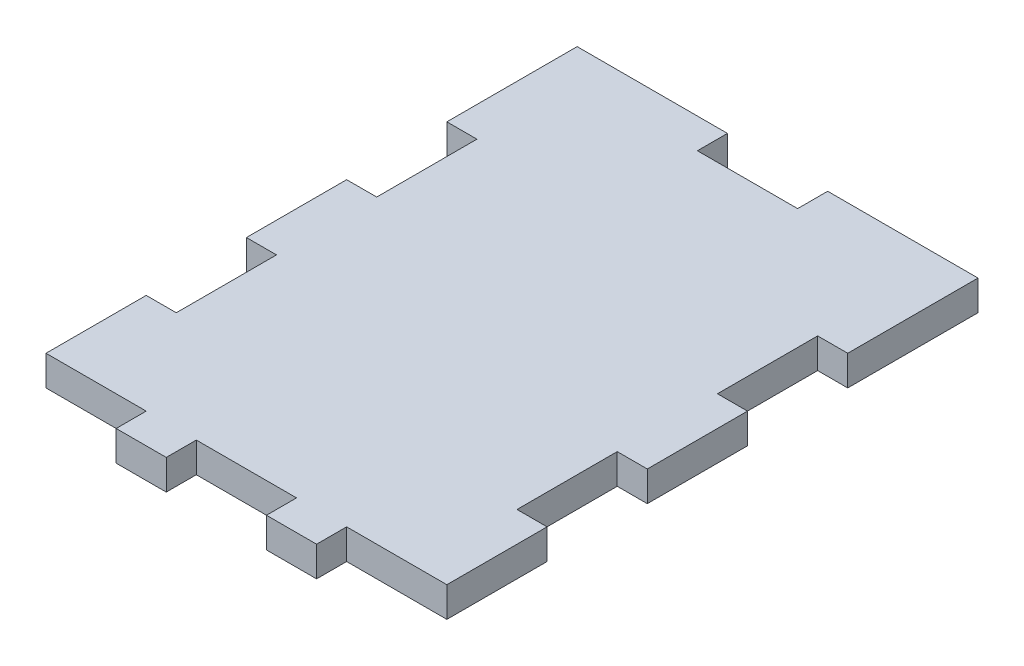
ISO-10303-21;
HEADER;
FILE_DESCRIPTION(('STEP AP214'),'2;1');
FILE_NAME('part.step','',(''),(''),'','','');
FILE_SCHEMA(('AUTOMOTIVE_DESIGN { 1 0 10303 214 1 1 1 1 }'));
ENDSEC;
DATA;
#1=APPLICATION_CONTEXT('core data for automotive mechanical design processes');
#2=APPLICATION_PROTOCOL_DEFINITION('international standard','automotive_design',2000,#1);
#3=PRODUCT_CONTEXT('',#1,'mechanical');
#4=PRODUCT('Part','Part','',(#3));
#5=PRODUCT_RELATED_PRODUCT_CATEGORY('part','',(#4));
#6=PRODUCT_DEFINITION_FORMATION('','',#4);
#7=PRODUCT_DEFINITION_CONTEXT('part definition',#1,'design');
#8=PRODUCT_DEFINITION('design','',#6,#7);
#9=PRODUCT_DEFINITION_SHAPE('','',#8);
#10=(LENGTH_UNIT() NAMED_UNIT(*) SI_UNIT(.MILLI.,.METRE.));
#11=(NAMED_UNIT(*) PLANE_ANGLE_UNIT() SI_UNIT($,.RADIAN.));
#12=(NAMED_UNIT(*) SI_UNIT($,.STERADIAN.) SOLID_ANGLE_UNIT());
#13=UNCERTAINTY_MEASURE_WITH_UNIT(LENGTH_MEASURE(1.E-05),#10,'distance_accuracy_value','');
#14=(GEOMETRIC_REPRESENTATION_CONTEXT(3) GLOBAL_UNCERTAINTY_ASSIGNED_CONTEXT((#13)) GLOBAL_UNIT_ASSIGNED_CONTEXT((#10,
#11,#12)) REPRESENTATION_CONTEXT('',''));
#15=CARTESIAN_POINT('',(0.,0.,0.));
#16=DIRECTION('',(0.,0.,1.));
#17=DIRECTION('',(1.,0.,0.));
#18=AXIS2_PLACEMENT_3D('',#15,#16,#17);
#19=CARTESIAN_POINT('',(0.,6.,0.));
#20=DIRECTION('',(-1.,0.,0.));
#21=DIRECTION('',(0.,0.,1.));
#22=AXIS2_PLACEMENT_3D('',#19,#20,#21);
#23=PLANE('',#22);
#24=DIRECTION('',(0.,0.,-1.));
#25=VECTOR('',#24,1.);
#26=CARTESIAN_POINT('',(0.,0.,0.));
#27=LINE('',#26,#25);
#28=CARTESIAN_POINT('',(0.,0.,0.));
#29=VERTEX_POINT('',#28);
#30=CARTESIAN_POINT('',(0.,0.,-20.));
#31=VERTEX_POINT('',#30);
#32=EDGE_CURVE('E273',#29,#31,#27,.T.);
#33=ORIENTED_EDGE('',*,*,#32,.T.);
#34=DIRECTION('',(0.,-1.,0.));
#35=VECTOR('',#34,1.);
#36=CARTESIAN_POINT('',(0.,6.,-20.));
#37=LINE('',#36,#35);
#38=CARTESIAN_POINT('',(0.,6.,-20.));
#39=VERTEX_POINT('',#38);
#40=EDGE_CURVE('E11',#39,#31,#37,.T.);
#41=ORIENTED_EDGE('',*,*,#40,.F.);
#42=DIRECTION('',(0.,0.,-1.));
#43=VECTOR('',#42,1.);
#44=CARTESIAN_POINT('',(0.,6.,0.));
#45=LINE('',#44,#43);
#46=CARTESIAN_POINT('',(0.,6.,0.));
#47=VERTEX_POINT('',#46);
#48=EDGE_CURVE('E335',#47,#39,#45,.T.);
#49=ORIENTED_EDGE('',*,*,#48,.F.);
#50=DIRECTION('',(0.,-1.,0.));
#51=VECTOR('',#50,1.);
#52=CARTESIAN_POINT('',(0.,6.,0.));
#53=LINE('',#52,#51);
#54=EDGE_CURVE('E269',#47,#29,#53,.T.);
#55=ORIENTED_EDGE('',*,*,#54,.T.);
#56=EDGE_LOOP('',(#33,#41,#49,#55));
#57=FACE_BOUND('',#56,.T.);
#58=ADVANCED_FACE('F33',(#57),#23,.F.);
#59=CARTESIAN_POINT('',(0.,6.,-20.));
#60=DIRECTION('',(0.,0.,1.));
#61=DIRECTION('',(1.,0.,0.));
#62=AXIS2_PLACEMENT_3D('',#59,#60,#61);
#63=PLANE('',#62);
#64=DIRECTION('',(-1.,0.,0.));
#65=VECTOR('',#64,1.);
#66=CARTESIAN_POINT('',(0.,0.,-20.));
#67=LINE('',#66,#65);
#68=CARTESIAN_POINT('',(-6.00000000000001,0.,-20.));
#69=VERTEX_POINT('',#68);
#70=EDGE_CURVE('E276',#31,#69,#67,.T.);
#71=ORIENTED_EDGE('',*,*,#70,.T.);
#72=DIRECTION('',(0.,-1.,0.));
#73=VECTOR('',#72,1.);
#74=CARTESIAN_POINT('',(-6.00000000000001,6.,-20.));
#75=LINE('',#74,#73);
#76=CARTESIAN_POINT('',(-6.00000000000001,6.,-20.));
#77=VERTEX_POINT('',#76);
#78=EDGE_CURVE('E41',#77,#69,#75,.T.);
#79=ORIENTED_EDGE('',*,*,#78,.F.);
#80=DIRECTION('',(-1.,0.,0.));
#81=VECTOR('',#80,1.);
#82=CARTESIAN_POINT('',(0.,6.,-20.));
#83=LINE('',#82,#81);
#84=EDGE_CURVE('E164',#39,#77,#83,.T.);
#85=ORIENTED_EDGE('',*,*,#84,.F.);
#86=ORIENTED_EDGE('',*,*,#40,.T.);
#87=EDGE_LOOP('',(#71,#79,#85,#86));
#88=FACE_BOUND('',#87,.T.);
#89=ADVANCED_FACE('F513',(#88),#63,.F.);
#90=CARTESIAN_POINT('',(-6.00000000000001,6.,-20.));
#91=DIRECTION('',(-1.,0.,0.));
#92=DIRECTION('',(0.,0.,1.));
#93=AXIS2_PLACEMENT_3D('',#90,#91,#92);
#94=PLANE('',#93);
#95=DIRECTION('',(0.,0.,-1.));
#96=VECTOR('',#95,1.);
#97=CARTESIAN_POINT('',(-6.00000000000001,0.,-20.));
#98=LINE('',#97,#96);
#99=CARTESIAN_POINT('',(-6.00000000000001,0.,-40.));
#100=VERTEX_POINT('',#99);
#101=EDGE_CURVE('E278',#69,#100,#98,.T.);
#102=ORIENTED_EDGE('',*,*,#101,.T.);
#103=DIRECTION('',(0.,-1.,0.));
#104=VECTOR('',#103,1.);
#105=CARTESIAN_POINT('',(-6.00000000000001,6.,-40.));
#106=LINE('',#105,#104);
#107=CARTESIAN_POINT('',(-6.00000000000001,6.,-40.));
#108=VERTEX_POINT('',#107);
#109=EDGE_CURVE('E414',#108,#100,#106,.T.);
#110=ORIENTED_EDGE('',*,*,#109,.F.);
#111=DIRECTION('',(0.,0.,-1.));
#112=VECTOR('',#111,1.);
#113=CARTESIAN_POINT('',(-6.00000000000001,6.,-20.));
#114=LINE('',#113,#112);
#115=EDGE_CURVE('E422',#77,#108,#114,.T.);
#116=ORIENTED_EDGE('',*,*,#115,.F.);
#117=ORIENTED_EDGE('',*,*,#78,.T.);
#118=EDGE_LOOP('',(#102,#110,#116,#117));
#119=FACE_BOUND('',#118,.T.);
#120=ADVANCED_FACE('F420',(#119),#94,.F.);
#121=CARTESIAN_POINT('',(-6.00000000000001,6.,-40.));
#122=DIRECTION('',(0.,0.,-1.));
#123=DIRECTION('',(-1.,0.,0.));
#124=AXIS2_PLACEMENT_3D('',#121,#122,#123);
#125=PLANE('',#124);
#126=DIRECTION('',(1.,0.,0.));
#127=VECTOR('',#126,1.);
#128=CARTESIAN_POINT('',(-6.00000000000001,0.,-40.));
#129=LINE('',#128,#127);
#130=CARTESIAN_POINT('',(0.,0.,-40.));
#131=VERTEX_POINT('',#130);
#132=EDGE_CURVE('E280',#100,#131,#129,.T.);
#133=ORIENTED_EDGE('',*,*,#132,.T.);
#134=DIRECTION('',(0.,-1.,0.));
#135=VECTOR('',#134,1.);
#136=CARTESIAN_POINT('',(0.,6.,-40.));
#137=LINE('',#136,#135);
#138=CARTESIAN_POINT('',(0.,6.,-40.));
#139=VERTEX_POINT('',#138);
#140=EDGE_CURVE('E411',#139,#131,#137,.T.);
#141=ORIENTED_EDGE('',*,*,#140,.F.);
#142=DIRECTION('',(1.,0.,0.));
#143=VECTOR('',#142,1.);
#144=CARTESIAN_POINT('',(-6.00000000000001,6.,-40.));
#145=LINE('',#144,#143);
#146=EDGE_CURVE('E440',#108,#139,#145,.T.);
#147=ORIENTED_EDGE('',*,*,#146,.F.);
#148=ORIENTED_EDGE('',*,*,#109,.T.);
#149=EDGE_LOOP('',(#133,#141,#147,#148));
#150=FACE_BOUND('',#149,.T.);
#151=ADVANCED_FACE('F431',(#150),#125,.F.);
#152=CARTESIAN_POINT('',(0.,6.,-40.));
#153=DIRECTION('',(-1.,0.,0.));
#154=DIRECTION('',(0.,0.,1.));
#155=AXIS2_PLACEMENT_3D('',#152,#153,#154);
#156=PLANE('',#155);
#157=DIRECTION('',(0.,0.,-1.));
#158=VECTOR('',#157,1.);
#159=CARTESIAN_POINT('',(0.,0.,-40.));
#160=LINE('',#159,#158);
#161=CARTESIAN_POINT('',(0.,0.,-60.));
#162=VERTEX_POINT('',#161);
#163=EDGE_CURVE('E282',#131,#162,#160,.T.);
#164=ORIENTED_EDGE('',*,*,#163,.T.);
#165=DIRECTION('',(0.,-1.,0.));
#166=VECTOR('',#165,1.);
#167=CARTESIAN_POINT('',(0.,6.,-60.));
#168=LINE('',#167,#166);
#169=CARTESIAN_POINT('',(0.,6.,-60.));
#170=VERTEX_POINT('',#169);
#171=EDGE_CURVE('E408',#170,#162,#168,.T.);
#172=ORIENTED_EDGE('',*,*,#171,.F.);
#173=DIRECTION('',(0.,0.,-1.));
#174=VECTOR('',#173,1.);
#175=CARTESIAN_POINT('',(0.,6.,-40.));
#176=LINE('',#175,#174);
#177=EDGE_CURVE('E437',#139,#170,#176,.T.);
#178=ORIENTED_EDGE('',*,*,#177,.F.);
#179=ORIENTED_EDGE('',*,*,#140,.T.);
#180=EDGE_LOOP('',(#164,#172,#178,#179));
#181=FACE_BOUND('',#180,.T.);
#182=ADVANCED_FACE('F435',(#181),#156,.F.);
#183=CARTESIAN_POINT('',(0.,6.,-60.));
#184=DIRECTION('',(0.,0.,1.));
#185=DIRECTION('',(1.,0.,0.));
#186=AXIS2_PLACEMENT_3D('',#183,#184,#185);
#187=PLANE('',#186);
#188=DIRECTION('',(-1.,0.,0.));
#189=VECTOR('',#188,1.);
#190=CARTESIAN_POINT('',(0.,0.,-60.));
#191=LINE('',#190,#189);
#192=CARTESIAN_POINT('',(-6.00000000000001,0.,-60.));
#193=VERTEX_POINT('',#192);
#194=EDGE_CURVE('E284',#162,#193,#191,.T.);
#195=ORIENTED_EDGE('',*,*,#194,.T.);
#196=DIRECTION('',(0.,-1.,0.));
#197=VECTOR('',#196,1.);
#198=CARTESIAN_POINT('',(-6.00000000000001,6.,-60.));
#199=LINE('',#198,#197);
#200=CARTESIAN_POINT('',(-6.00000000000001,6.,-60.));
#201=VERTEX_POINT('',#200);
#202=EDGE_CURVE('E405',#201,#193,#199,.T.);
#203=ORIENTED_EDGE('',*,*,#202,.F.);
#204=DIRECTION('',(-1.,0.,0.));
#205=VECTOR('',#204,1.);
#206=CARTESIAN_POINT('',(0.,6.,-60.));
#207=LINE('',#206,#205);
#208=EDGE_CURVE('E439',#170,#201,#207,.T.);
#209=ORIENTED_EDGE('',*,*,#208,.F.);
#210=ORIENTED_EDGE('',*,*,#171,.T.);
#211=EDGE_LOOP('',(#195,#203,#209,#210));
#212=FACE_BOUND('',#211,.T.);
#213=ADVANCED_FACE('F526',(#212),#187,.F.);
#214=CARTESIAN_POINT('',(-6.00000000000001,6.,-60.));
#215=DIRECTION('',(-1.,0.,0.));
#216=DIRECTION('',(0.,0.,1.));
#217=AXIS2_PLACEMENT_3D('',#214,#215,#216);
#218=PLANE('',#217);
#219=DIRECTION('',(0.,0.,-1.));
#220=VECTOR('',#219,1.);
#221=CARTESIAN_POINT('',(-6.00000000000001,0.,-60.));
#222=LINE('',#221,#220);
#223=CARTESIAN_POINT('',(-6.00000000000001,0.,-80.));
#224=VERTEX_POINT('',#223);
#225=EDGE_CURVE('E286',#193,#224,#222,.T.);
#226=ORIENTED_EDGE('',*,*,#225,.T.);
#227=DIRECTION('',(0.,-1.,0.));
#228=VECTOR('',#227,1.);
#229=CARTESIAN_POINT('',(-6.00000000000001,6.,-80.));
#230=LINE('',#229,#228);
#231=CARTESIAN_POINT('',(-6.00000000000001,6.,-80.));
#232=VERTEX_POINT('',#231);
#233=EDGE_CURVE('E402',#232,#224,#230,.T.);
#234=ORIENTED_EDGE('',*,*,#233,.F.);
#235=DIRECTION('',(0.,0.,-1.));
#236=VECTOR('',#235,1.);
#237=CARTESIAN_POINT('',(-6.00000000000001,6.,-60.));
#238=LINE('',#237,#236);
#239=EDGE_CURVE('E442',#201,#232,#238,.T.);
#240=ORIENTED_EDGE('',*,*,#239,.F.);
#241=ORIENTED_EDGE('',*,*,#202,.T.);
#242=EDGE_LOOP('',(#226,#234,#240,#241));
#243=FACE_BOUND('',#242,.T.);
#244=ADVANCED_FACE('F529',(#243),#218,.F.);
#245=CARTESIAN_POINT('',(-6.00000000000001,6.,-80.));
#246=DIRECTION('',(0.,0.,-1.));
#247=DIRECTION('',(-1.,0.,0.));
#248=AXIS2_PLACEMENT_3D('',#245,#246,#247);
#249=PLANE('',#248);
#250=DIRECTION('',(1.,0.,0.));
#251=VECTOR('',#250,1.);
#252=CARTESIAN_POINT('',(-6.00000000000001,0.,-80.));
#253=LINE('',#252,#251);
#254=CARTESIAN_POINT('',(0.,0.,-80.));
#255=VERTEX_POINT('',#254);
#256=EDGE_CURVE('E288',#224,#255,#253,.T.);
#257=ORIENTED_EDGE('',*,*,#256,.T.);
#258=DIRECTION('',(0.,-1.,0.));
#259=VECTOR('',#258,1.);
#260=CARTESIAN_POINT('',(0.,6.,-80.));
#261=LINE('',#260,#259);
#262=CARTESIAN_POINT('',(0.,6.,-80.));
#263=VERTEX_POINT('',#262);
#264=EDGE_CURVE('E399',#263,#255,#261,.T.);
#265=ORIENTED_EDGE('',*,*,#264,.F.);
#266=DIRECTION('',(1.,0.,0.));
#267=VECTOR('',#266,1.);
#268=CARTESIAN_POINT('',(-6.00000000000001,6.,-80.));
#269=LINE('',#268,#267);
#270=EDGE_CURVE('E448',#232,#263,#269,.T.);
#271=ORIENTED_EDGE('',*,*,#270,.F.);
#272=ORIENTED_EDGE('',*,*,#233,.T.);
#273=EDGE_LOOP('',(#257,#265,#271,#272));
#274=FACE_BOUND('',#273,.T.);
#275=ADVANCED_FACE('F533',(#274),#249,.F.);
#276=CARTESIAN_POINT('',(0.,6.,-80.));
#277=DIRECTION('',(-1.,0.,0.));
#278=DIRECTION('',(0.,0.,1.));
#279=AXIS2_PLACEMENT_3D('',#276,#277,#278);
#280=PLANE('',#279);
#281=DIRECTION('',(0.,0.,-1.));
#282=VECTOR('',#281,1.);
#283=CARTESIAN_POINT('',(0.,0.,-80.));
#284=LINE('',#283,#282);
#285=CARTESIAN_POINT('',(0.,0.,-106.));
#286=VERTEX_POINT('',#285);
#287=EDGE_CURVE('E290',#255,#286,#284,.T.);
#288=ORIENTED_EDGE('',*,*,#287,.T.);
#289=DIRECTION('',(0.,-1.,0.));
#290=VECTOR('',#289,1.);
#291=CARTESIAN_POINT('',(0.,6.,-106.));
#292=LINE('',#291,#290);
#293=CARTESIAN_POINT('',(0.,6.,-106.));
#294=VERTEX_POINT('',#293);
#295=EDGE_CURVE('E396',#294,#286,#292,.T.);
#296=ORIENTED_EDGE('',*,*,#295,.F.);
#297=DIRECTION('',(0.,0.,-1.));
#298=VECTOR('',#297,1.);
#299=CARTESIAN_POINT('',(0.,6.,-80.));
#300=LINE('',#299,#298);
#301=EDGE_CURVE('E450',#263,#294,#300,.T.);
#302=ORIENTED_EDGE('',*,*,#301,.F.);
#303=ORIENTED_EDGE('',*,*,#264,.T.);
#304=EDGE_LOOP('',(#288,#296,#302,#303));
#305=FACE_BOUND('',#304,.T.);
#306=ADVANCED_FACE('F537',(#305),#280,.F.);
#307=CARTESIAN_POINT('',(0.,6.,-106.));
#308=DIRECTION('',(0.,0.,1.));
#309=DIRECTION('',(1.,0.,0.));
#310=AXIS2_PLACEMENT_3D('',#307,#308,#309);
#311=PLANE('',#310);
#312=DIRECTION('',(-1.,0.,0.));
#313=VECTOR('',#312,1.);
#314=CARTESIAN_POINT('',(0.,0.,-106.));
#315=LINE('',#314,#313);
#316=CARTESIAN_POINT('',(-30.,0.,-106.));
#317=VERTEX_POINT('',#316);
#318=EDGE_CURVE('E292',#286,#317,#315,.T.);
#319=ORIENTED_EDGE('',*,*,#318,.T.);
#320=DIRECTION('',(0.,-1.,0.));
#321=VECTOR('',#320,1.);
#322=CARTESIAN_POINT('',(-30.,6.,-106.));
#323=LINE('',#322,#321);
#324=CARTESIAN_POINT('',(-30.,6.,-106.));
#325=VERTEX_POINT('',#324);
#326=EDGE_CURVE('E393',#325,#317,#323,.T.);
#327=ORIENTED_EDGE('',*,*,#326,.F.);
#328=DIRECTION('',(-1.,0.,0.));
#329=VECTOR('',#328,1.);
#330=CARTESIAN_POINT('',(0.,6.,-106.));
#331=LINE('',#330,#329);
#332=EDGE_CURVE('E452',#294,#325,#331,.T.);
#333=ORIENTED_EDGE('',*,*,#332,.F.);
#334=ORIENTED_EDGE('',*,*,#295,.T.);
#335=EDGE_LOOP('',(#319,#327,#333,#334));
#336=FACE_BOUND('',#335,.T.);
#337=ADVANCED_FACE('F541',(#336),#311,.F.);
#338=CARTESIAN_POINT('',(-30.,6.,-100.));
#339=DIRECTION('',(1.,0.,0.));
#340=DIRECTION('',(0.,0.,-1.));
#341=AXIS2_PLACEMENT_3D('',#338,#339,#340);
#342=PLANE('',#341);
#343=DIRECTION('',(0.,0.,1.));
#344=VECTOR('',#343,1.);
#345=CARTESIAN_POINT('',(-30.,0.,-100.));
#346=LINE('',#345,#344);
#347=CARTESIAN_POINT('',(-30.,0.,-100.));
#348=VERTEX_POINT('',#347);
#349=EDGE_CURVE('E294',#317,#348,#346,.T.);
#350=ORIENTED_EDGE('',*,*,#349,.T.);
#351=DIRECTION('',(0.,-1.,0.));
#352=VECTOR('',#351,1.);
#353=CARTESIAN_POINT('',(-30.,6.,-100.));
#354=LINE('',#353,#352);
#355=CARTESIAN_POINT('',(-30.,6.,-100.));
#356=VERTEX_POINT('',#355);
#357=EDGE_CURVE('E390',#356,#348,#354,.T.);
#358=ORIENTED_EDGE('',*,*,#357,.F.);
#359=DIRECTION('',(0.,0.,1.));
#360=VECTOR('',#359,1.);
#361=CARTESIAN_POINT('',(-30.,6.,-100.));
#362=LINE('',#361,#360);
#363=EDGE_CURVE('E454',#325,#356,#362,.T.);
#364=ORIENTED_EDGE('',*,*,#363,.F.);
#365=ORIENTED_EDGE('',*,*,#326,.T.);
#366=EDGE_LOOP('',(#350,#358,#364,#365));
#367=FACE_BOUND('',#366,.T.);
#368=ADVANCED_FACE('F545',(#367),#342,.F.);
#369=CARTESIAN_POINT('',(-50.,6.,-100.));
#370=DIRECTION('',(0.,0.,1.));
#371=DIRECTION('',(1.,0.,0.));
#372=AXIS2_PLACEMENT_3D('',#369,#370,#371);
#373=PLANE('',#372);
#374=DIRECTION('',(-1.,0.,0.));
#375=VECTOR('',#374,1.);
#376=CARTESIAN_POINT('',(-50.,0.,-100.));
#377=LINE('',#376,#375);
#378=CARTESIAN_POINT('',(-50.,0.,-100.));
#379=VERTEX_POINT('',#378);
#380=EDGE_CURVE('E296',#348,#379,#377,.T.);
#381=ORIENTED_EDGE('',*,*,#380,.T.);
#382=DIRECTION('',(0.,-1.,0.));
#383=VECTOR('',#382,1.);
#384=CARTESIAN_POINT('',(-50.,6.,-100.));
#385=LINE('',#384,#383);
#386=CARTESIAN_POINT('',(-50.,6.,-100.));
#387=VERTEX_POINT('',#386);
#388=EDGE_CURVE('E387',#387,#379,#385,.T.);
#389=ORIENTED_EDGE('',*,*,#388,.F.);
#390=DIRECTION('',(-1.,0.,0.));
#391=VECTOR('',#390,1.);
#392=CARTESIAN_POINT('',(-50.,6.,-100.));
#393=LINE('',#392,#391);
#394=EDGE_CURVE('E456',#356,#387,#393,.T.);
#395=ORIENTED_EDGE('',*,*,#394,.F.);
#396=ORIENTED_EDGE('',*,*,#357,.T.);
#397=EDGE_LOOP('',(#381,#389,#395,#396));
#398=FACE_BOUND('',#397,.T.);
#399=ADVANCED_FACE('F549',(#398),#373,.F.);
#400=CARTESIAN_POINT('',(-50.,6.,-106.));
#401=DIRECTION('',(-1.,0.,0.));
#402=DIRECTION('',(0.,0.,1.));
#403=AXIS2_PLACEMENT_3D('',#400,#401,#402);
#404=PLANE('',#403);
#405=DIRECTION('',(0.,0.,-1.));
#406=VECTOR('',#405,1.);
#407=CARTESIAN_POINT('',(-50.,0.,-106.));
#408=LINE('',#407,#406);
#409=CARTESIAN_POINT('',(-50.,0.,-106.));
#410=VERTEX_POINT('',#409);
#411=EDGE_CURVE('E298',#379,#410,#408,.T.);
#412=ORIENTED_EDGE('',*,*,#411,.T.);
#413=DIRECTION('',(0.,-1.,0.));
#414=VECTOR('',#413,1.);
#415=CARTESIAN_POINT('',(-50.,6.,-106.));
#416=LINE('',#415,#414);
#417=CARTESIAN_POINT('',(-50.,6.,-106.));
#418=VERTEX_POINT('',#417);
#419=EDGE_CURVE('E384',#418,#410,#416,.T.);
#420=ORIENTED_EDGE('',*,*,#419,.F.);
#421=DIRECTION('',(0.,0.,-1.));
#422=VECTOR('',#421,1.);
#423=CARTESIAN_POINT('',(-50.,6.,-106.));
#424=LINE('',#423,#422);
#425=EDGE_CURVE('E458',#387,#418,#424,.T.);
#426=ORIENTED_EDGE('',*,*,#425,.F.);
#427=ORIENTED_EDGE('',*,*,#388,.T.);
#428=EDGE_LOOP('',(#412,#420,#426,#427));
#429=FACE_BOUND('',#428,.T.);
#430=ADVANCED_FACE('F553',(#429),#404,.F.);
#431=CARTESIAN_POINT('',(-50.,6.,-106.));
#432=DIRECTION('',(0.,0.,1.));
#433=DIRECTION('',(1.,0.,0.));
#434=AXIS2_PLACEMENT_3D('',#431,#432,#433);
#435=PLANE('',#434);
#436=DIRECTION('',(-1.,0.,0.));
#437=VECTOR('',#436,1.);
#438=CARTESIAN_POINT('',(-50.,0.,-106.));
#439=LINE('',#438,#437);
#440=CARTESIAN_POINT('',(-80.,0.,-106.));
#441=VERTEX_POINT('',#440);
#442=EDGE_CURVE('E300',#410,#441,#439,.T.);
#443=ORIENTED_EDGE('',*,*,#442,.T.);
#444=DIRECTION('',(0.,-1.,0.));
#445=VECTOR('',#444,1.);
#446=CARTESIAN_POINT('',(-80.,6.,-106.));
#447=LINE('',#446,#445);
#448=CARTESIAN_POINT('',(-80.,6.,-106.));
#449=VERTEX_POINT('',#448);
#450=EDGE_CURVE('E381',#449,#441,#447,.T.);
#451=ORIENTED_EDGE('',*,*,#450,.F.);
#452=DIRECTION('',(-1.,0.,0.));
#453=VECTOR('',#452,1.);
#454=CARTESIAN_POINT('',(-50.,6.,-106.));
#455=LINE('',#454,#453);
#456=EDGE_CURVE('E460',#418,#449,#455,.T.);
#457=ORIENTED_EDGE('',*,*,#456,.F.);
#458=ORIENTED_EDGE('',*,*,#419,.T.);
#459=EDGE_LOOP('',(#443,#451,#457,#458));
#460=FACE_BOUND('',#459,.T.);
#461=ADVANCED_FACE('F557',(#460),#435,.F.);
#462=CARTESIAN_POINT('',(-80.,6.,-80.));
#463=DIRECTION('',(1.,0.,0.));
#464=DIRECTION('',(0.,0.,-1.));
#465=AXIS2_PLACEMENT_3D('',#462,#463,#464);
#466=PLANE('',#465);
#467=DIRECTION('',(0.,0.,1.));
#468=VECTOR('',#467,1.);
#469=CARTESIAN_POINT('',(-80.,0.,-80.));
#470=LINE('',#469,#468);
#471=CARTESIAN_POINT('',(-80.,0.,-80.));
#472=VERTEX_POINT('',#471);
#473=EDGE_CURVE('E302',#441,#472,#470,.T.);
#474=ORIENTED_EDGE('',*,*,#473,.T.);
#475=DIRECTION('',(0.,-1.,0.));
#476=VECTOR('',#475,1.);
#477=CARTESIAN_POINT('',(-80.,6.,-80.));
#478=LINE('',#477,#476);
#479=CARTESIAN_POINT('',(-80.,6.,-80.));
#480=VERTEX_POINT('',#479);
#481=EDGE_CURVE('E378',#480,#472,#478,.T.);
#482=ORIENTED_EDGE('',*,*,#481,.F.);
#483=DIRECTION('',(0.,0.,1.));
#484=VECTOR('',#483,1.);
#485=CARTESIAN_POINT('',(-80.,6.,-80.));
#486=LINE('',#485,#484);
#487=EDGE_CURVE('E462',#449,#480,#486,.T.);
#488=ORIENTED_EDGE('',*,*,#487,.F.);
#489=ORIENTED_EDGE('',*,*,#450,.T.);
#490=EDGE_LOOP('',(#474,#482,#488,#489));
#491=FACE_BOUND('',#490,.T.);
#492=ADVANCED_FACE('F561',(#491),#466,.F.);
#493=CARTESIAN_POINT('',(-80.,6.,-80.));
#494=DIRECTION('',(0.,0.,-1.));
#495=DIRECTION('',(-1.,0.,0.));
#496=AXIS2_PLACEMENT_3D('',#493,#494,#495);
#497=PLANE('',#496);
#498=DIRECTION('',(1.,0.,0.));
#499=VECTOR('',#498,1.);
#500=CARTESIAN_POINT('',(-80.,0.,-80.));
#501=LINE('',#500,#499);
#502=CARTESIAN_POINT('',(-74.,0.,-80.));
#503=VERTEX_POINT('',#502);
#504=EDGE_CURVE('E304',#472,#503,#501,.T.);
#505=ORIENTED_EDGE('',*,*,#504,.T.);
#506=DIRECTION('',(0.,-1.,0.));
#507=VECTOR('',#506,1.);
#508=CARTESIAN_POINT('',(-74.,6.,-80.));
#509=LINE('',#508,#507);
#510=CARTESIAN_POINT('',(-74.,6.,-80.));
#511=VERTEX_POINT('',#510);
#512=EDGE_CURVE('E375',#511,#503,#509,.T.);
#513=ORIENTED_EDGE('',*,*,#512,.F.);
#514=DIRECTION('',(1.,0.,0.));
#515=VECTOR('',#514,1.);
#516=CARTESIAN_POINT('',(-80.,6.,-80.));
#517=LINE('',#516,#515);
#518=EDGE_CURVE('E464',#480,#511,#517,.T.);
#519=ORIENTED_EDGE('',*,*,#518,.F.);
#520=ORIENTED_EDGE('',*,*,#481,.T.);
#521=EDGE_LOOP('',(#505,#513,#519,#520));
#522=FACE_BOUND('',#521,.T.);
#523=ADVANCED_FACE('F565',(#522),#497,.F.);
#524=CARTESIAN_POINT('',(-74.,6.,-80.));
#525=DIRECTION('',(1.,0.,0.));
#526=DIRECTION('',(0.,0.,-1.));
#527=AXIS2_PLACEMENT_3D('',#524,#525,#526);
#528=PLANE('',#527);
#529=DIRECTION('',(0.,0.,1.));
#530=VECTOR('',#529,1.);
#531=CARTESIAN_POINT('',(-74.,0.,-80.));
#532=LINE('',#531,#530);
#533=CARTESIAN_POINT('',(-74.,0.,-60.));
#534=VERTEX_POINT('',#533);
#535=EDGE_CURVE('E306',#503,#534,#532,.T.);
#536=ORIENTED_EDGE('',*,*,#535,.T.);
#537=DIRECTION('',(0.,-1.,0.));
#538=VECTOR('',#537,1.);
#539=CARTESIAN_POINT('',(-74.,6.,-60.));
#540=LINE('',#539,#538);
#541=CARTESIAN_POINT('',(-74.,6.,-60.));
#542=VERTEX_POINT('',#541);
#543=EDGE_CURVE('E372',#542,#534,#540,.T.);
#544=ORIENTED_EDGE('',*,*,#543,.F.);
#545=DIRECTION('',(0.,0.,1.));
#546=VECTOR('',#545,1.);
#547=CARTESIAN_POINT('',(-74.,6.,-80.));
#548=LINE('',#547,#546);
#549=EDGE_CURVE('E466',#511,#542,#548,.T.);
#550=ORIENTED_EDGE('',*,*,#549,.F.);
#551=ORIENTED_EDGE('',*,*,#512,.T.);
#552=EDGE_LOOP('',(#536,#544,#550,#551));
#553=FACE_BOUND('',#552,.T.);
#554=ADVANCED_FACE('F569',(#553),#528,.F.);
#555=CARTESIAN_POINT('',(-74.,6.,-60.));
#556=DIRECTION('',(0.,0.,1.));
#557=DIRECTION('',(1.,0.,0.));
#558=AXIS2_PLACEMENT_3D('',#555,#556,#557);
#559=PLANE('',#558);
#560=DIRECTION('',(-1.,0.,0.));
#561=VECTOR('',#560,1.);
#562=CARTESIAN_POINT('',(-74.,0.,-60.));
#563=LINE('',#562,#561);
#564=CARTESIAN_POINT('',(-80.,0.,-60.));
#565=VERTEX_POINT('',#564);
#566=EDGE_CURVE('E308',#534,#565,#563,.T.);
#567=ORIENTED_EDGE('',*,*,#566,.T.);
#568=DIRECTION('',(0.,-1.,0.));
#569=VECTOR('',#568,1.);
#570=CARTESIAN_POINT('',(-80.,6.,-60.));
#571=LINE('',#570,#569);
#572=CARTESIAN_POINT('',(-80.,6.,-60.));
#573=VERTEX_POINT('',#572);
#574=EDGE_CURVE('E369',#573,#565,#571,.T.);
#575=ORIENTED_EDGE('',*,*,#574,.F.);
#576=DIRECTION('',(-1.,0.,0.));
#577=VECTOR('',#576,1.);
#578=CARTESIAN_POINT('',(-74.,6.,-60.));
#579=LINE('',#578,#577);
#580=EDGE_CURVE('E468',#542,#573,#579,.T.);
#581=ORIENTED_EDGE('',*,*,#580,.F.);
#582=ORIENTED_EDGE('',*,*,#543,.T.);
#583=EDGE_LOOP('',(#567,#575,#581,#582));
#584=FACE_BOUND('',#583,.T.);
#585=ADVANCED_FACE('F573',(#584),#559,.F.);
#586=CARTESIAN_POINT('',(-80.,6.,-60.));
#587=DIRECTION('',(1.,0.,0.));
#588=DIRECTION('',(0.,0.,-1.));
#589=AXIS2_PLACEMENT_3D('',#586,#587,#588);
#590=PLANE('',#589);
#591=DIRECTION('',(0.,0.,1.));
#592=VECTOR('',#591,1.);
#593=CARTESIAN_POINT('',(-80.,0.,-60.));
#594=LINE('',#593,#592);
#595=CARTESIAN_POINT('',(-80.,0.,-40.));
#596=VERTEX_POINT('',#595);
#597=EDGE_CURVE('E310',#565,#596,#594,.T.);
#598=ORIENTED_EDGE('',*,*,#597,.T.);
#599=DIRECTION('',(0.,-1.,0.));
#600=VECTOR('',#599,1.);
#601=CARTESIAN_POINT('',(-80.,6.,-40.));
#602=LINE('',#601,#600);
#603=CARTESIAN_POINT('',(-80.,6.,-40.));
#604=VERTEX_POINT('',#603);
#605=EDGE_CURVE('E366',#604,#596,#602,.T.);
#606=ORIENTED_EDGE('',*,*,#605,.F.);
#607=DIRECTION('',(0.,0.,1.));
#608=VECTOR('',#607,1.);
#609=CARTESIAN_POINT('',(-80.,6.,-60.));
#610=LINE('',#609,#608);
#611=EDGE_CURVE('E470',#573,#604,#610,.T.);
#612=ORIENTED_EDGE('',*,*,#611,.F.);
#613=ORIENTED_EDGE('',*,*,#574,.T.);
#614=EDGE_LOOP('',(#598,#606,#612,#613));
#615=FACE_BOUND('',#614,.T.);
#616=ADVANCED_FACE('F577',(#615),#590,.F.);
#617=CARTESIAN_POINT('',(-80.,6.,-40.));
#618=DIRECTION('',(0.,0.,-1.));
#619=DIRECTION('',(-1.,0.,0.));
#620=AXIS2_PLACEMENT_3D('',#617,#618,#619);
#621=PLANE('',#620);
#622=DIRECTION('',(1.,0.,0.));
#623=VECTOR('',#622,1.);
#624=CARTESIAN_POINT('',(-80.,0.,-40.));
#625=LINE('',#624,#623);
#626=CARTESIAN_POINT('',(-74.,0.,-40.));
#627=VERTEX_POINT('',#626);
#628=EDGE_CURVE('E312',#596,#627,#625,.T.);
#629=ORIENTED_EDGE('',*,*,#628,.T.);
#630=DIRECTION('',(0.,-1.,0.));
#631=VECTOR('',#630,1.);
#632=CARTESIAN_POINT('',(-74.,6.,-40.));
#633=LINE('',#632,#631);
#634=CARTESIAN_POINT('',(-74.,6.,-40.));
#635=VERTEX_POINT('',#634);
#636=EDGE_CURVE('E363',#635,#627,#633,.T.);
#637=ORIENTED_EDGE('',*,*,#636,.F.);
#638=DIRECTION('',(1.,0.,0.));
#639=VECTOR('',#638,1.);
#640=CARTESIAN_POINT('',(-80.,6.,-40.));
#641=LINE('',#640,#639);
#642=EDGE_CURVE('E472',#604,#635,#641,.T.);
#643=ORIENTED_EDGE('',*,*,#642,.F.);
#644=ORIENTED_EDGE('',*,*,#605,.T.);
#645=EDGE_LOOP('',(#629,#637,#643,#644));
#646=FACE_BOUND('',#645,.T.);
#647=ADVANCED_FACE('F581',(#646),#621,.F.);
#648=CARTESIAN_POINT('',(-74.,6.,-40.));
#649=DIRECTION('',(1.,0.,0.));
#650=DIRECTION('',(0.,0.,-1.));
#651=AXIS2_PLACEMENT_3D('',#648,#649,#650);
#652=PLANE('',#651);
#653=DIRECTION('',(0.,0.,1.));
#654=VECTOR('',#653,1.);
#655=CARTESIAN_POINT('',(-74.,0.,-40.));
#656=LINE('',#655,#654);
#657=CARTESIAN_POINT('',(-74.,0.,-20.));
#658=VERTEX_POINT('',#657);
#659=EDGE_CURVE('E314',#627,#658,#656,.T.);
#660=ORIENTED_EDGE('',*,*,#659,.T.);
#661=DIRECTION('',(0.,-1.,0.));
#662=VECTOR('',#661,1.);
#663=CARTESIAN_POINT('',(-74.,6.,-20.));
#664=LINE('',#663,#662);
#665=CARTESIAN_POINT('',(-74.,6.,-20.));
#666=VERTEX_POINT('',#665);
#667=EDGE_CURVE('E360',#666,#658,#664,.T.);
#668=ORIENTED_EDGE('',*,*,#667,.F.);
#669=DIRECTION('',(0.,0.,1.));
#670=VECTOR('',#669,1.);
#671=CARTESIAN_POINT('',(-74.,6.,-40.));
#672=LINE('',#671,#670);
#673=EDGE_CURVE('E474',#635,#666,#672,.T.);
#674=ORIENTED_EDGE('',*,*,#673,.F.);
#675=ORIENTED_EDGE('',*,*,#636,.T.);
#676=EDGE_LOOP('',(#660,#668,#674,#675));
#677=FACE_BOUND('',#676,.T.);
#678=ADVANCED_FACE('F585',(#677),#652,.F.);
#679=CARTESIAN_POINT('',(-74.,6.,-20.));
#680=DIRECTION('',(0.,0.,1.));
#681=DIRECTION('',(1.,0.,0.));
#682=AXIS2_PLACEMENT_3D('',#679,#680,#681);
#683=PLANE('',#682);
#684=DIRECTION('',(-1.,0.,0.));
#685=VECTOR('',#684,1.);
#686=CARTESIAN_POINT('',(-74.,0.,-20.));
#687=LINE('',#686,#685);
#688=CARTESIAN_POINT('',(-80.,0.,-20.));
#689=VERTEX_POINT('',#688);
#690=EDGE_CURVE('E316',#658,#689,#687,.T.);
#691=ORIENTED_EDGE('',*,*,#690,.T.);
#692=DIRECTION('',(0.,-1.,0.));
#693=VECTOR('',#692,1.);
#694=CARTESIAN_POINT('',(-80.,6.,-20.));
#695=LINE('',#694,#693);
#696=CARTESIAN_POINT('',(-80.,6.,-20.));
#697=VERTEX_POINT('',#696);
#698=EDGE_CURVE('E357',#697,#689,#695,.T.);
#699=ORIENTED_EDGE('',*,*,#698,.F.);
#700=DIRECTION('',(-1.,0.,0.));
#701=VECTOR('',#700,1.);
#702=CARTESIAN_POINT('',(-74.,6.,-20.));
#703=LINE('',#702,#701);
#704=EDGE_CURVE('E476',#666,#697,#703,.T.);
#705=ORIENTED_EDGE('',*,*,#704,.F.);
#706=ORIENTED_EDGE('',*,*,#667,.T.);
#707=EDGE_LOOP('',(#691,#699,#705,#706));
#708=FACE_BOUND('',#707,.T.);
#709=ADVANCED_FACE('F589',(#708),#683,.F.);
#710=CARTESIAN_POINT('',(-80.,6.,0.));
#711=DIRECTION('',(1.,0.,0.));
#712=DIRECTION('',(0.,0.,-1.));
#713=AXIS2_PLACEMENT_3D('',#710,#711,#712);
#714=PLANE('',#713);
#715=DIRECTION('',(0.,0.,1.));
#716=VECTOR('',#715,1.);
#717=CARTESIAN_POINT('',(-80.,0.,0.));
#718=LINE('',#717,#716);
#719=CARTESIAN_POINT('',(-80.,0.,0.));
#720=VERTEX_POINT('',#719);
#721=EDGE_CURVE('E318',#689,#720,#718,.T.);
#722=ORIENTED_EDGE('',*,*,#721,.T.);
#723=DIRECTION('',(0.,-1.,0.));
#724=VECTOR('',#723,1.);
#725=CARTESIAN_POINT('',(-80.,6.,0.));
#726=LINE('',#725,#724);
#727=CARTESIAN_POINT('',(-80.,6.,0.));
#728=VERTEX_POINT('',#727);
#729=EDGE_CURVE('E354',#728,#720,#726,.T.);
#730=ORIENTED_EDGE('',*,*,#729,.F.);
#731=DIRECTION('',(0.,0.,1.));
#732=VECTOR('',#731,1.);
#733=CARTESIAN_POINT('',(-80.,6.,0.));
#734=LINE('',#733,#732);
#735=EDGE_CURVE('E478',#697,#728,#734,.T.);
#736=ORIENTED_EDGE('',*,*,#735,.F.);
#737=ORIENTED_EDGE('',*,*,#698,.T.);
#738=EDGE_LOOP('',(#722,#730,#736,#737));
#739=FACE_BOUND('',#738,.T.);
#740=ADVANCED_FACE('F593',(#739),#714,.F.);
#741=CARTESIAN_POINT('',(-60.,6.,0.));
#742=DIRECTION('',(0.,0.,-1.));
#743=DIRECTION('',(-1.,0.,0.));
#744=AXIS2_PLACEMENT_3D('',#741,#742,#743);
#745=PLANE('',#744);
#746=DIRECTION('',(1.,0.,0.));
#747=VECTOR('',#746,1.);
#748=CARTESIAN_POINT('',(-60.,0.,0.));
#749=LINE('',#748,#747);
#750=CARTESIAN_POINT('',(-60.,0.,0.));
#751=VERTEX_POINT('',#750);
#752=EDGE_CURVE('E320',#720,#751,#749,.T.);
#753=ORIENTED_EDGE('',*,*,#752,.T.);
#754=DIRECTION('',(0.,-1.,0.));
#755=VECTOR('',#754,1.);
#756=CARTESIAN_POINT('',(-60.,6.,0.));
#757=LINE('',#756,#755);
#758=CARTESIAN_POINT('',(-60.,6.,0.));
#759=VERTEX_POINT('',#758);
#760=EDGE_CURVE('E351',#759,#751,#757,.T.);
#761=ORIENTED_EDGE('',*,*,#760,.F.);
#762=DIRECTION('',(1.,0.,0.));
#763=VECTOR('',#762,1.);
#764=CARTESIAN_POINT('',(-60.,6.,0.));
#765=LINE('',#764,#763);
#766=EDGE_CURVE('E480',#728,#759,#765,.T.);
#767=ORIENTED_EDGE('',*,*,#766,.F.);
#768=ORIENTED_EDGE('',*,*,#729,.T.);
#769=EDGE_LOOP('',(#753,#761,#767,#768));
#770=FACE_BOUND('',#769,.T.);
#771=ADVANCED_FACE('F597',(#770),#745,.F.);
#772=CARTESIAN_POINT('',(-60.,6.,0.));
#773=DIRECTION('',(1.,0.,0.));
#774=DIRECTION('',(0.,0.,-1.));
#775=AXIS2_PLACEMENT_3D('',#772,#773,#774);
#776=PLANE('',#775);
#777=DIRECTION('',(0.,0.,1.));
#778=VECTOR('',#777,1.);
#779=CARTESIAN_POINT('',(-60.,0.,0.));
#780=LINE('',#779,#778);
#781=CARTESIAN_POINT('',(-60.,0.,6.00000000000001));
#782=VERTEX_POINT('',#781);
#783=EDGE_CURVE('E322',#751,#782,#780,.T.);
#784=ORIENTED_EDGE('',*,*,#783,.T.);
#785=DIRECTION('',(0.,-1.,0.));
#786=VECTOR('',#785,1.);
#787=CARTESIAN_POINT('',(-60.,6.,6.00000000000001));
#788=LINE('',#787,#786);
#789=CARTESIAN_POINT('',(-60.,6.,6.00000000000001));
#790=VERTEX_POINT('',#789);
#791=EDGE_CURVE('E348',#790,#782,#788,.T.);
#792=ORIENTED_EDGE('',*,*,#791,.F.);
#793=DIRECTION('',(0.,0.,1.));
#794=VECTOR('',#793,1.);
#795=CARTESIAN_POINT('',(-60.,6.,0.));
#796=LINE('',#795,#794);
#797=EDGE_CURVE('E482',#759,#790,#796,.T.);
#798=ORIENTED_EDGE('',*,*,#797,.F.);
#799=ORIENTED_EDGE('',*,*,#760,.T.);
#800=EDGE_LOOP('',(#784,#792,#798,#799));
#801=FACE_BOUND('',#800,.T.);
#802=ADVANCED_FACE('F601',(#801),#776,.F.);
#803=CARTESIAN_POINT('',(-60.,6.,6.00000000000001));
#804=DIRECTION('',(0.,0.,-1.));
#805=DIRECTION('',(-1.,0.,0.));
#806=AXIS2_PLACEMENT_3D('',#803,#804,#805);
#807=PLANE('',#806);
#808=DIRECTION('',(1.,0.,0.));
#809=VECTOR('',#808,1.);
#810=CARTESIAN_POINT('',(-60.,0.,6.00000000000001));
#811=LINE('',#810,#809);
#812=CARTESIAN_POINT('',(-50.,0.,6.00000000000001));
#813=VERTEX_POINT('',#812);
#814=EDGE_CURVE('E324',#782,#813,#811,.T.);
#815=ORIENTED_EDGE('',*,*,#814,.T.);
#816=DIRECTION('',(0.,-1.,0.));
#817=VECTOR('',#816,1.);
#818=CARTESIAN_POINT('',(-50.,6.,6.00000000000001));
#819=LINE('',#818,#817);
#820=CARTESIAN_POINT('',(-50.,6.,6.00000000000001));
#821=VERTEX_POINT('',#820);
#822=EDGE_CURVE('E345',#821,#813,#819,.T.);
#823=ORIENTED_EDGE('',*,*,#822,.F.);
#824=DIRECTION('',(1.,0.,0.));
#825=VECTOR('',#824,1.);
#826=CARTESIAN_POINT('',(-60.,6.,6.00000000000001));
#827=LINE('',#826,#825);
#828=EDGE_CURVE('E484',#790,#821,#827,.T.);
#829=ORIENTED_EDGE('',*,*,#828,.F.);
#830=ORIENTED_EDGE('',*,*,#791,.T.);
#831=EDGE_LOOP('',(#815,#823,#829,#830));
#832=FACE_BOUND('',#831,.T.);
#833=ADVANCED_FACE('F605',(#832),#807,.F.);
#834=CARTESIAN_POINT('',(-50.,6.,6.00000000000001));
#835=DIRECTION('',(-1.,0.,0.));
#836=DIRECTION('',(0.,0.,1.));
#837=AXIS2_PLACEMENT_3D('',#834,#835,#836);
#838=PLANE('',#837);
#839=DIRECTION('',(0.,0.,-1.));
#840=VECTOR('',#839,1.);
#841=CARTESIAN_POINT('',(-50.,0.,6.00000000000001));
#842=LINE('',#841,#840);
#843=CARTESIAN_POINT('',(-50.,0.,0.));
#844=VERTEX_POINT('',#843);
#845=EDGE_CURVE('E326',#813,#844,#842,.T.);
#846=ORIENTED_EDGE('',*,*,#845,.T.);
#847=DIRECTION('',(0.,-1.,0.));
#848=VECTOR('',#847,1.);
#849=CARTESIAN_POINT('',(-50.,6.,0.));
#850=LINE('',#849,#848);
#851=CARTESIAN_POINT('',(-50.,6.,0.));
#852=VERTEX_POINT('',#851);
#853=EDGE_CURVE('E342',#852,#844,#850,.T.);
#854=ORIENTED_EDGE('',*,*,#853,.F.);
#855=DIRECTION('',(0.,0.,-1.));
#856=VECTOR('',#855,1.);
#857=CARTESIAN_POINT('',(-50.,6.,6.00000000000001));
#858=LINE('',#857,#856);
#859=EDGE_CURVE('E486',#821,#852,#858,.T.);
#860=ORIENTED_EDGE('',*,*,#859,.F.);
#861=ORIENTED_EDGE('',*,*,#822,.T.);
#862=EDGE_LOOP('',(#846,#854,#860,#861));
#863=FACE_BOUND('',#862,.T.);
#864=ADVANCED_FACE('F609',(#863),#838,.F.);
#865=CARTESIAN_POINT('',(-50.,6.,0.));
#866=DIRECTION('',(0.,0.,-1.));
#867=DIRECTION('',(-1.,0.,0.));
#868=AXIS2_PLACEMENT_3D('',#865,#866,#867);
#869=PLANE('',#868);
#870=DIRECTION('',(1.,0.,0.));
#871=VECTOR('',#870,1.);
#872=CARTESIAN_POINT('',(-50.,0.,0.));
#873=LINE('',#872,#871);
#874=CARTESIAN_POINT('',(-30.,0.,0.));
#875=VERTEX_POINT('',#874);
#876=EDGE_CURVE('E328',#844,#875,#873,.T.);
#877=ORIENTED_EDGE('',*,*,#876,.T.);
#878=DIRECTION('',(0.,-1.,0.));
#879=VECTOR('',#878,1.);
#880=CARTESIAN_POINT('',(-30.,6.,0.));
#881=LINE('',#880,#879);
#882=CARTESIAN_POINT('',(-30.,6.,0.));
#883=VERTEX_POINT('',#882);
#884=EDGE_CURVE('E339',#883,#875,#881,.T.);
#885=ORIENTED_EDGE('',*,*,#884,.F.);
#886=DIRECTION('',(1.,0.,0.));
#887=VECTOR('',#886,1.);
#888=CARTESIAN_POINT('',(-50.,6.,0.));
#889=LINE('',#888,#887);
#890=EDGE_CURVE('E488',#852,#883,#889,.T.);
#891=ORIENTED_EDGE('',*,*,#890,.F.);
#892=ORIENTED_EDGE('',*,*,#853,.T.);
#893=EDGE_LOOP('',(#877,#885,#891,#892));
#894=FACE_BOUND('',#893,.T.);
#895=ADVANCED_FACE('F494',(#894),#869,.F.);
#896=CARTESIAN_POINT('',(-30.,6.,0.));
#897=DIRECTION('',(1.,0.,0.));
#898=DIRECTION('',(0.,0.,-1.));
#899=AXIS2_PLACEMENT_3D('',#896,#897,#898);
#900=PLANE('',#899);
#901=DIRECTION('',(0.,0.,1.));
#902=VECTOR('',#901,1.);
#903=CARTESIAN_POINT('',(-30.,0.,0.));
#904=LINE('',#903,#902);
#905=CARTESIAN_POINT('',(-30.,0.,6.00000000000001));
#906=VERTEX_POINT('',#905);
#907=EDGE_CURVE('E330',#875,#906,#904,.T.);
#908=ORIENTED_EDGE('',*,*,#907,.T.);
#909=DIRECTION('',(0.,-1.,0.));
#910=VECTOR('',#909,1.);
#911=CARTESIAN_POINT('',(-30.,6.,6.00000000000001));
#912=LINE('',#911,#910);
#913=CARTESIAN_POINT('',(-30.,6.,6.00000000000001));
#914=VERTEX_POINT('',#913);
#915=EDGE_CURVE('E264',#914,#906,#912,.T.);
#916=ORIENTED_EDGE('',*,*,#915,.F.);
#917=DIRECTION('',(0.,0.,1.));
#918=VECTOR('',#917,1.);
#919=CARTESIAN_POINT('',(-30.,6.,0.));
#920=LINE('',#919,#918);
#921=EDGE_CURVE('E255',#883,#914,#920,.T.);
#922=ORIENTED_EDGE('',*,*,#921,.F.);
#923=ORIENTED_EDGE('',*,*,#884,.T.);
#924=EDGE_LOOP('',(#908,#916,#922,#923));
#925=FACE_BOUND('',#924,.T.);
#926=ADVANCED_FACE('F498',(#925),#900,.F.);
#927=CARTESIAN_POINT('',(-30.,6.,6.00000000000001));
#928=DIRECTION('',(0.,0.,-1.));
#929=DIRECTION('',(-1.,0.,0.));
#930=AXIS2_PLACEMENT_3D('',#927,#928,#929);
#931=PLANE('',#930);
#932=DIRECTION('',(1.,0.,0.));
#933=VECTOR('',#932,1.);
#934=CARTESIAN_POINT('',(-30.,0.,6.00000000000001));
#935=LINE('',#934,#933);
#936=CARTESIAN_POINT('',(-20.,0.,6.00000000000001));
#937=VERTEX_POINT('',#936);
#938=EDGE_CURVE('E263',#906,#937,#935,.T.);
#939=ORIENTED_EDGE('',*,*,#938,.T.);
#940=DIRECTION('',(0.,-1.,0.));
#941=VECTOR('',#940,1.);
#942=CARTESIAN_POINT('',(-20.,6.,6.00000000000001));
#943=LINE('',#942,#941);
#944=CARTESIAN_POINT('',(-20.,6.,6.00000000000001));
#945=VERTEX_POINT('',#944);
#946=EDGE_CURVE('E260',#945,#937,#943,.T.);
#947=ORIENTED_EDGE('',*,*,#946,.F.);
#948=DIRECTION('',(1.,0.,0.));
#949=VECTOR('',#948,1.);
#950=CARTESIAN_POINT('',(-30.,6.,6.00000000000001));
#951=LINE('',#950,#949);
#952=EDGE_CURVE('E249',#914,#945,#951,.T.);
#953=ORIENTED_EDGE('',*,*,#952,.F.);
#954=ORIENTED_EDGE('',*,*,#915,.T.);
#955=EDGE_LOOP('',(#939,#947,#953,#954));
#956=FACE_BOUND('',#955,.T.);
#957=ADVANCED_FACE('F261',(#956),#931,.F.);
#958=CARTESIAN_POINT('',(-20.,6.,6.00000000000001));
#959=DIRECTION('',(-1.,0.,0.));
#960=DIRECTION('',(0.,0.,1.));
#961=AXIS2_PLACEMENT_3D('',#958,#959,#960);
#962=PLANE('',#961);
#963=DIRECTION('',(0.,0.,-1.));
#964=VECTOR('',#963,1.);
#965=CARTESIAN_POINT('',(-20.,0.,6.00000000000001));
#966=LINE('',#965,#964);
#967=CARTESIAN_POINT('',(-20.,0.,0.));
#968=VERTEX_POINT('',#967);
#969=EDGE_CURVE('E150',#937,#968,#966,.T.);
#970=ORIENTED_EDGE('',*,*,#969,.T.);
#971=DIRECTION('',(0.,-1.,0.));
#972=VECTOR('',#971,1.);
#973=CARTESIAN_POINT('',(-20.,6.,0.));
#974=LINE('',#973,#972);
#975=CARTESIAN_POINT('',(-20.,6.,0.));
#976=VERTEX_POINT('',#975);
#977=EDGE_CURVE('E265',#976,#968,#974,.T.);
#978=ORIENTED_EDGE('',*,*,#977,.F.);
#979=DIRECTION('',(0.,0.,-1.));
#980=VECTOR('',#979,1.);
#981=CARTESIAN_POINT('',(-20.,6.,6.00000000000001));
#982=LINE('',#981,#980);
#983=EDGE_CURVE('E253',#945,#976,#982,.T.);
#984=ORIENTED_EDGE('',*,*,#983,.F.);
#985=ORIENTED_EDGE('',*,*,#946,.T.);
#986=EDGE_LOOP('',(#970,#978,#984,#985));
#987=FACE_BOUND('',#986,.T.);
#988=ADVANCED_FACE('F267',(#987),#962,.F.);
#989=CARTESIAN_POINT('',(0.,6.,0.));
#990=DIRECTION('',(0.,0.,-1.));
#991=DIRECTION('',(-1.,0.,0.));
#992=AXIS2_PLACEMENT_3D('',#989,#990,#991);
#993=PLANE('',#992);
#994=DIRECTION('',(1.,0.,0.));
#995=VECTOR('',#994,1.);
#996=CARTESIAN_POINT('',(0.,0.,0.));
#997=LINE('',#996,#995);
#998=EDGE_CURVE('E156',#968,#29,#997,.T.);
#999=ORIENTED_EDGE('',*,*,#998,.T.);
#1000=ORIENTED_EDGE('',*,*,#54,.F.);
#1001=DIRECTION('',(1.,0.,0.));
#1002=VECTOR('',#1001,1.);
#1003=CARTESIAN_POINT('',(0.,6.,0.));
#1004=LINE('',#1003,#1002);
#1005=EDGE_CURVE('E49',#976,#47,#1004,.T.);
#1006=ORIENTED_EDGE('',*,*,#1005,.F.);
#1007=ORIENTED_EDGE('',*,*,#977,.T.);
#1008=EDGE_LOOP('',(#999,#1000,#1006,#1007));
#1009=FACE_BOUND('',#1008,.T.);
#1010=ADVANCED_FACE('F502',(#1009),#993,.F.);
#1011=CARTESIAN_POINT('',(0.,6.,0.));
#1012=DIRECTION('',(0.,1.,0.));
#1013=DIRECTION('',(0.,0.,1.));
#1014=AXIS2_PLACEMENT_3D('',#1011,#1012,#1013);
#1015=PLANE('',#1014);
#1016=ORIENTED_EDGE('',*,*,#48,.T.);
#1017=ORIENTED_EDGE('',*,*,#84,.T.);
#1018=ORIENTED_EDGE('',*,*,#115,.T.);
#1019=ORIENTED_EDGE('',*,*,#146,.T.);
#1020=ORIENTED_EDGE('',*,*,#177,.T.);
#1021=ORIENTED_EDGE('',*,*,#208,.T.);
#1022=ORIENTED_EDGE('',*,*,#239,.T.);
#1023=ORIENTED_EDGE('',*,*,#270,.T.);
#1024=ORIENTED_EDGE('',*,*,#301,.T.);
#1025=ORIENTED_EDGE('',*,*,#332,.T.);
#1026=ORIENTED_EDGE('',*,*,#363,.T.);
#1027=ORIENTED_EDGE('',*,*,#394,.T.);
#1028=ORIENTED_EDGE('',*,*,#425,.T.);
#1029=ORIENTED_EDGE('',*,*,#456,.T.);
#1030=ORIENTED_EDGE('',*,*,#487,.T.);
#1031=ORIENTED_EDGE('',*,*,#518,.T.);
#1032=ORIENTED_EDGE('',*,*,#549,.T.);
#1033=ORIENTED_EDGE('',*,*,#580,.T.);
#1034=ORIENTED_EDGE('',*,*,#611,.T.);
#1035=ORIENTED_EDGE('',*,*,#642,.T.);
#1036=ORIENTED_EDGE('',*,*,#673,.T.);
#1037=ORIENTED_EDGE('',*,*,#704,.T.);
#1038=ORIENTED_EDGE('',*,*,#735,.T.);
#1039=ORIENTED_EDGE('',*,*,#766,.T.);
#1040=ORIENTED_EDGE('',*,*,#797,.T.);
#1041=ORIENTED_EDGE('',*,*,#828,.T.);
#1042=ORIENTED_EDGE('',*,*,#859,.T.);
#1043=ORIENTED_EDGE('',*,*,#890,.T.);
#1044=ORIENTED_EDGE('',*,*,#921,.T.);
#1045=ORIENTED_EDGE('',*,*,#952,.T.);
#1046=ORIENTED_EDGE('',*,*,#983,.T.);
#1047=ORIENTED_EDGE('',*,*,#1005,.T.);
#1048=EDGE_LOOP('',(#1016,#1017,#1018,#1019,#1020,#1021,#1022,#1023,#1024,#1025,#1026,#1027,
#1028,#1029,#1030,#1031,#1032,#1033,#1034,#1035,#1036,#1037,#1038,#1039,#1040,#1041,#1042,#1043,
#1044,#1045,#1046,#1047));
#1049=FACE_BOUND('',#1048,.T.);
#1050=ADVANCED_FACE('F251',(#1049),#1015,.T.);
#1051=CARTESIAN_POINT('',(0.,0.,0.));
#1052=DIRECTION('',(0.,1.,0.));
#1053=DIRECTION('',(0.,0.,1.));
#1054=AXIS2_PLACEMENT_3D('',#1051,#1052,#1053);
#1055=PLANE('',#1054);
#1056=ORIENTED_EDGE('',*,*,#32,.F.);
#1057=ORIENTED_EDGE('',*,*,#998,.F.);
#1058=ORIENTED_EDGE('',*,*,#969,.F.);
#1059=ORIENTED_EDGE('',*,*,#938,.F.);
#1060=ORIENTED_EDGE('',*,*,#907,.F.);
#1061=ORIENTED_EDGE('',*,*,#876,.F.);
#1062=ORIENTED_EDGE('',*,*,#845,.F.);
#1063=ORIENTED_EDGE('',*,*,#814,.F.);
#1064=ORIENTED_EDGE('',*,*,#783,.F.);
#1065=ORIENTED_EDGE('',*,*,#752,.F.);
#1066=ORIENTED_EDGE('',*,*,#721,.F.);
#1067=ORIENTED_EDGE('',*,*,#690,.F.);
#1068=ORIENTED_EDGE('',*,*,#659,.F.);
#1069=ORIENTED_EDGE('',*,*,#628,.F.);
#1070=ORIENTED_EDGE('',*,*,#597,.F.);
#1071=ORIENTED_EDGE('',*,*,#566,.F.);
#1072=ORIENTED_EDGE('',*,*,#535,.F.);
#1073=ORIENTED_EDGE('',*,*,#504,.F.);
#1074=ORIENTED_EDGE('',*,*,#473,.F.);
#1075=ORIENTED_EDGE('',*,*,#442,.F.);
#1076=ORIENTED_EDGE('',*,*,#411,.F.);
#1077=ORIENTED_EDGE('',*,*,#380,.F.);
#1078=ORIENTED_EDGE('',*,*,#349,.F.);
#1079=ORIENTED_EDGE('',*,*,#318,.F.);
#1080=ORIENTED_EDGE('',*,*,#287,.F.);
#1081=ORIENTED_EDGE('',*,*,#256,.F.);
#1082=ORIENTED_EDGE('',*,*,#225,.F.);
#1083=ORIENTED_EDGE('',*,*,#194,.F.);
#1084=ORIENTED_EDGE('',*,*,#163,.F.);
#1085=ORIENTED_EDGE('',*,*,#132,.F.);
#1086=ORIENTED_EDGE('',*,*,#101,.F.);
#1087=ORIENTED_EDGE('',*,*,#70,.F.);
#1088=EDGE_LOOP('',(#1056,#1057,#1058,#1059,#1060,#1061,#1062,#1063,#1064,#1065,#1066,#1067,
#1068,#1069,#1070,#1071,#1072,#1073,#1074,#1075,#1076,#1077,#1078,#1079,#1080,#1081,#1082,#1083,
#1084,#1085,#1086,#1087));
#1089=FACE_BOUND('',#1088,.T.);
#1090=ADVANCED_FACE('F426',(#1089),#1055,.F.);
#1091=CLOSED_SHELL('',(#58,#89,#120,#151,#182,#213,#244,#275,#306,#337,#368,#399,#430,#461,#492,
#523,#554,#585,#616,#647,#678,#709,#740,#771,#802,#833,#864,#895,#926,#957,#988,#1010,#1050,#1090));
#1092=MANIFOLD_SOLID_BREP('B2',#1091);
#1093=ADVANCED_BREP_SHAPE_REPRESENTATION('',(#18,#1092),#14);
#1094=SHAPE_DEFINITION_REPRESENTATION(#9,#1093);
ENDSEC;
END-ISO-10303-21;
